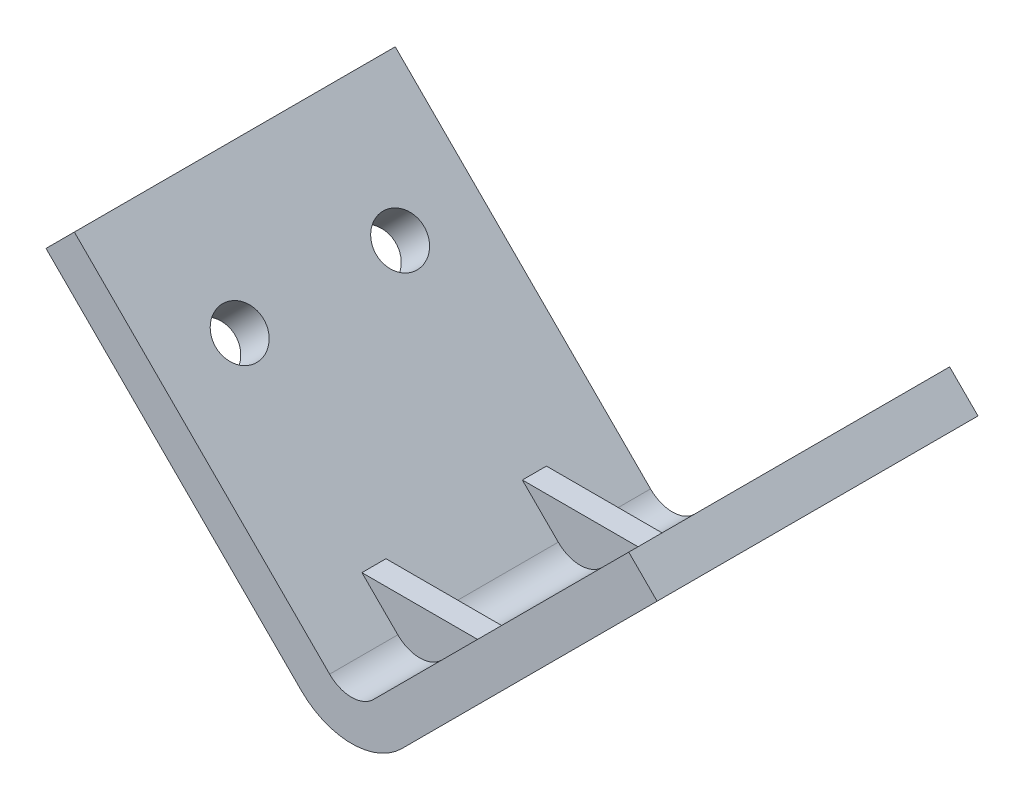
ISO-10303-21;
HEADER;
FILE_DESCRIPTION(('STEP AP214'),'2;1');
FILE_NAME('part.step','',(''),(''),'','','');
FILE_SCHEMA(('AUTOMOTIVE_DESIGN { 1 0 10303 214 1 1 1 1 }'));
ENDSEC;
DATA;
#1=APPLICATION_CONTEXT('core data for automotive mechanical design processes');
#2=APPLICATION_PROTOCOL_DEFINITION('international standard','automotive_design',2000,#1);
#3=PRODUCT_CONTEXT('',#1,'mechanical');
#4=PRODUCT('Part','Part','',(#3));
#5=PRODUCT_RELATED_PRODUCT_CATEGORY('part','',(#4));
#6=PRODUCT_DEFINITION_FORMATION('','',#4);
#7=PRODUCT_DEFINITION_CONTEXT('part definition',#1,'design');
#8=PRODUCT_DEFINITION('design','',#6,#7);
#9=PRODUCT_DEFINITION_SHAPE('','',#8);
#10=(LENGTH_UNIT() NAMED_UNIT(*) SI_UNIT(.MILLI.,.METRE.));
#11=(NAMED_UNIT(*) PLANE_ANGLE_UNIT() SI_UNIT($,.RADIAN.));
#12=(NAMED_UNIT(*) SI_UNIT($,.STERADIAN.) SOLID_ANGLE_UNIT());
#13=UNCERTAINTY_MEASURE_WITH_UNIT(LENGTH_MEASURE(1.E-05),#10,'distance_accuracy_value','');
#14=(GEOMETRIC_REPRESENTATION_CONTEXT(3) GLOBAL_UNCERTAINTY_ASSIGNED_CONTEXT((#13)) GLOBAL_UNIT_ASSIGNED_CONTEXT((#10,
#11,#12)) REPRESENTATION_CONTEXT('',''));
#15=CARTESIAN_POINT('',(0.,0.,0.));
#16=DIRECTION('',(0.,0.,1.));
#17=DIRECTION('',(1.,0.,0.));
#18=AXIS2_PLACEMENT_3D('',#15,#16,#17);
#19=CARTESIAN_POINT('',(50.,8.86619772367581,40.0000000008731));
#20=DIRECTION('',(0.,0.,-1.));
#21=DIRECTION('',(1.,0.,0.));
#22=AXIS2_PLACEMENT_3D('',#19,#20,#21);
#23=CYLINDRICAL_SURFACE('',#22,3.8661977236758);
#24=CARTESIAN_POINT('',(50.,8.86619772367581,28.5));
#25=DIRECTION('',(0.,0.,1.));
#26=DIRECTION('',(1.,0.,0.));
#27=AXIS2_PLACEMENT_3D('',#24,#25,#26);
#28=CIRCLE('',#27,3.8661977236758);
#29=CARTESIAN_POINT('',(52.7338146278192,6.13238309585666,28.5));
#30=VERTEX_POINT('',#29);
#31=CARTESIAN_POINT('',(47.2661853721808,6.13238309585665,28.5));
#32=VERTEX_POINT('',#31);
#33=EDGE_CURVE('E231',#30,#32,#28,.F.);
#34=ORIENTED_EDGE('',*,*,#33,.F.);
#35=DIRECTION('',(0.,0.,-1.));
#36=VECTOR('',#35,1.);
#37=CARTESIAN_POINT('',(52.7338146278192,6.13238309585666,0.));
#38=LINE('',#37,#36);
#39=CARTESIAN_POINT('',(52.7338146278192,6.13238309585666,11.5));
#40=VERTEX_POINT('',#39);
#41=EDGE_CURVE('E260',#30,#40,#38,.T.);
#42=ORIENTED_EDGE('',*,*,#41,.T.);
#43=CARTESIAN_POINT('',(50.,8.86619772367581,11.5));
#44=DIRECTION('',(0.,0.,-1.));
#45=DIRECTION('',(-1.,0.,0.));
#46=AXIS2_PLACEMENT_3D('',#43,#44,#45);
#47=CIRCLE('',#46,3.8661977236758);
#48=CARTESIAN_POINT('',(47.2661853721808,6.13238309585665,11.5));
#49=VERTEX_POINT('',#48);
#50=EDGE_CURVE('E249',#49,#40,#47,.F.);
#51=ORIENTED_EDGE('',*,*,#50,.F.);
#52=DIRECTION('',(0.,0.,-1.));
#53=VECTOR('',#52,1.);
#54=CARTESIAN_POINT('',(47.2661853721808,6.13238309585665,0.));
#55=LINE('',#54,#53);
#56=EDGE_CURVE('E274',#32,#49,#55,.T.);
#57=ORIENTED_EDGE('',*,*,#56,.F.);
#58=EDGE_LOOP('',(#34,#42,#51,#57));
#59=FACE_BOUND('',#58,.T.);
#60=ADVANCED_FACE('F95',(#59),#23,.F.);
#61=CARTESIAN_POINT('',(15.4463802187863,37.9521882492513,0.));
#62=DIRECTION('',(0.707106781186549,0.707106781186546,0.));
#63=DIRECTION('',(0.,0.,1.));
#64=AXIS2_PLACEMENT_3D('',#61,#62,#63);
#65=PLANE('',#64);
#66=CARTESIAN_POINT('',(26.0529819365845,27.3455865314531,10.));
#67=DIRECTION('',(-0.707106781186549,-0.707106781186546,0.));
#68=DIRECTION('',(0.,0.,1.));
#69=AXIS2_PLACEMENT_3D('',#66,#67,#68);
#70=CIRCLE('',#69,3.);
#71=CARTESIAN_POINT('',(26.0529819365845,27.3455865314531,13.));
#72=VERTEX_POINT('',#71);
#73=EDGE_CURVE('E270',#72,#72,#70,.T.);
#74=ORIENTED_EDGE('',*,*,#73,.T.);
#75=EDGE_LOOP('',(#74));
#76=FACE_BOUND('',#75,.T.);
#77=CARTESIAN_POINT('',(26.0529819365845,27.3455865314531,30.));
#78=DIRECTION('',(0.707106781186549,0.707106781186546,0.));
#79=DIRECTION('',(0.,0.,1.));
#80=AXIS2_PLACEMENT_3D('',#77,#78,#79);
#81=CIRCLE('',#80,3.);
#82=CARTESIAN_POINT('',(26.0529819365845,27.3455865314531,33.));
#83=VERTEX_POINT('',#82);
#84=EDGE_CURVE('E324',#83,#83,#81,.T.);
#85=ORIENTED_EDGE('',*,*,#84,.F.);
#86=EDGE_LOOP('',(#85));
#87=FACE_BOUND('',#86,.T.);
#88=DIRECTION('',(0.,0.,1.));
#89=VECTOR('',#88,1.);
#90=CARTESIAN_POINT('',(42.7919667502393,10.6066017177982,0.));
#91=LINE('',#90,#89);
#92=CARTESIAN_POINT('',(42.7919667502393,10.6066017177982,28.5));
#93=VERTEX_POINT('',#92);
#94=CARTESIAN_POINT('',(42.7919667502393,10.6066017177982,31.5));
#95=VERTEX_POINT('',#94);
#96=EDGE_CURVE('E110',#93,#95,#91,.T.);
#97=ORIENTED_EDGE('',*,*,#96,.F.);
#98=DIRECTION('',(0.707106781186546,-0.707106781186549,0.));
#99=VECTOR('',#98,1.);
#100=CARTESIAN_POINT('',(15.4463802187863,37.9521882492513,28.5));
#101=LINE('',#100,#99);
#102=EDGE_CURVE('E234',#93,#32,#101,.T.);
#103=ORIENTED_EDGE('',*,*,#102,.T.);
#104=ORIENTED_EDGE('',*,*,#56,.T.);
#105=DIRECTION('',(-0.707106781186546,0.707106781186549,0.));
#106=VECTOR('',#105,1.);
#107=CARTESIAN_POINT('',(15.4463802187863,37.9521882492513,11.5));
#108=LINE('',#107,#106);
#109=CARTESIAN_POINT('',(42.7919667502393,10.6066017177982,11.5));
#110=VERTEX_POINT('',#109);
#111=EDGE_CURVE('E252',#49,#110,#108,.T.);
#112=ORIENTED_EDGE('',*,*,#111,.T.);
#113=DIRECTION('',(0.,0.,-1.));
#114=VECTOR('',#113,1.);
#115=CARTESIAN_POINT('',(42.7919667502393,10.6066017177982,0.));
#116=LINE('',#115,#114);
#117=CARTESIAN_POINT('',(42.7919667502393,10.6066017177982,8.5));
#118=VERTEX_POINT('',#117);
#119=EDGE_CURVE('E254',#110,#118,#116,.T.);
#120=ORIENTED_EDGE('',*,*,#119,.T.);
#121=DIRECTION('',(-0.707106781186546,0.707106781186549,0.));
#122=VECTOR('',#121,1.);
#123=CARTESIAN_POINT('',(15.4463802187863,37.9521882492513,8.5));
#124=LINE('',#123,#122);
#125=CARTESIAN_POINT('',(47.2661853721808,6.13238309585665,8.5));
#126=VERTEX_POINT('',#125);
#127=EDGE_CURVE('E246',#126,#118,#124,.T.);
#128=ORIENTED_EDGE('',*,*,#127,.F.);
#129=CARTESIAN_POINT('',(47.2661853721808,6.13238309585665,0.));
#130=VERTEX_POINT('',#129);
#131=EDGE_CURVE('E275',#126,#130,#55,.T.);
#132=ORIENTED_EDGE('',*,*,#131,.T.);
#133=DIRECTION('',(-0.707106781186546,0.707106781186549,0.));
#134=VECTOR('',#133,1.);
#135=CARTESIAN_POINT('',(15.4463802187863,37.9521882492513,0.));
#136=LINE('',#135,#134);
#137=CARTESIAN_POINT('',(15.4463802187863,37.9521882492513,0.));
#138=VERTEX_POINT('',#137);
#139=EDGE_CURVE('E305',#130,#138,#136,.T.);
#140=ORIENTED_EDGE('',*,*,#139,.T.);
#141=DIRECTION('',(0.,0.,1.));
#142=VECTOR('',#141,1.);
#143=CARTESIAN_POINT('',(15.4463802187863,37.9521882492513,0.));
#144=LINE('',#143,#142);
#145=CARTESIAN_POINT('',(15.4463802187863,37.9521882492513,40.));
#146=VERTEX_POINT('',#145);
#147=EDGE_CURVE('E308',#138,#146,#144,.T.);
#148=ORIENTED_EDGE('',*,*,#147,.T.);
#149=DIRECTION('',(0.707106781186546,-0.707106781186549,0.));
#150=VECTOR('',#149,1.);
#151=CARTESIAN_POINT('',(15.4463802187863,37.9521882492513,40.));
#152=LINE('',#151,#150);
#153=CARTESIAN_POINT('',(47.2661853721808,6.13238309585665,40.));
#154=VERTEX_POINT('',#153);
#155=EDGE_CURVE('E273',#146,#154,#152,.T.);
#156=ORIENTED_EDGE('',*,*,#155,.T.);
#157=CARTESIAN_POINT('',(47.2661853721808,6.13238309585665,31.5));
#158=VERTEX_POINT('',#157);
#159=EDGE_CURVE('E271',#154,#158,#55,.T.);
#160=ORIENTED_EDGE('',*,*,#159,.T.);
#161=DIRECTION('',(0.707106781186546,-0.707106781186549,0.));
#162=VECTOR('',#161,1.);
#163=CARTESIAN_POINT('',(15.4463802187863,37.9521882492513,31.5));
#164=LINE('',#163,#162);
#165=EDGE_CURVE('E115',#95,#158,#164,.T.);
#166=ORIENTED_EDGE('',*,*,#165,.F.);
#167=EDGE_LOOP('',(#97,#103,#104,#112,#120,#128,#132,#140,#148,#156,#160,#166));
#168=FACE_BOUND('',#167,.T.);
#169=ADVANCED_FACE('F404',(#76,#87,#168),#65,.T.);
#170=CARTESIAN_POINT('',(13.8429416625591,-32.7584898694035,0.));
#171=DIRECTION('',(-0.707106781186549,0.707106781186546,0.));
#172=DIRECTION('',(0.,0.,1.));
#173=AXIS2_PLACEMENT_3D('',#170,#171,#172);
#174=PLANE('',#173);
#175=CARTESIAN_POINT('',(73.9470180634156,27.3455865314531,30.));
#176=DIRECTION('',(0.707106781186549,-0.707106781186546,0.));
#177=DIRECTION('',(0.,0.,1.));
#178=AXIS2_PLACEMENT_3D('',#175,#176,#177);
#179=CIRCLE('',#178,3.00000000000001);
#180=CARTESIAN_POINT('',(73.9470180634156,27.3455865314531,33.));
#181=VERTEX_POINT('',#180);
#182=EDGE_CURVE('E304',#181,#181,#179,.T.);
#183=ORIENTED_EDGE('',*,*,#182,.T.);
#184=EDGE_LOOP('',(#183));
#185=FACE_BOUND('',#184,.T.);
#186=CARTESIAN_POINT('',(73.9470180634156,27.3455865314531,10.));
#187=DIRECTION('',(-0.707106781186549,0.707106781186546,0.));
#188=DIRECTION('',(0.,0.,1.));
#189=AXIS2_PLACEMENT_3D('',#186,#187,#188);
#190=CIRCLE('',#189,3.00000000000001);
#191=CARTESIAN_POINT('',(73.9470180634156,27.3455865314531,13.));
#192=VERTEX_POINT('',#191);
#193=EDGE_CURVE('E256',#192,#192,#190,.T.);
#194=ORIENTED_EDGE('',*,*,#193,.F.);
#195=EDGE_LOOP('',(#194));
#196=FACE_BOUND('',#195,.T.);
#197=ORIENTED_EDGE('',*,*,#41,.F.);
#198=DIRECTION('',(0.707106781186546,0.707106781186549,0.));
#199=VECTOR('',#198,1.);
#200=CARTESIAN_POINT('',(13.8429416625591,-32.7584898694035,28.5));
#201=LINE('',#200,#199);
#202=CARTESIAN_POINT('',(57.2080332497607,10.6066017177982,28.5));
#203=VERTEX_POINT('',#202);
#204=EDGE_CURVE('E211',#30,#203,#201,.T.);
#205=ORIENTED_EDGE('',*,*,#204,.T.);
#206=DIRECTION('',(0.,0.,-1.));
#207=VECTOR('',#206,1.);
#208=CARTESIAN_POINT('',(57.2080332497607,10.6066017177982,0.));
#209=LINE('',#208,#207);
#210=CARTESIAN_POINT('',(57.2080332497607,10.6066017177982,31.5));
#211=VERTEX_POINT('',#210);
#212=EDGE_CURVE('E13',#211,#203,#209,.T.);
#213=ORIENTED_EDGE('',*,*,#212,.F.);
#214=DIRECTION('',(0.707106781186546,0.707106781186549,0.));
#215=VECTOR('',#214,1.);
#216=CARTESIAN_POINT('',(13.8429416625591,-32.7584898694035,31.5));
#217=LINE('',#216,#215);
#218=CARTESIAN_POINT('',(52.7338146278192,6.13238309585666,31.5));
#219=VERTEX_POINT('',#218);
#220=EDGE_CURVE('E208',#219,#211,#217,.T.);
#221=ORIENTED_EDGE('',*,*,#220,.F.);
#222=CARTESIAN_POINT('',(52.7338146278192,6.13238309585666,40.));
#223=VERTEX_POINT('',#222);
#224=EDGE_CURVE('E257',#223,#219,#38,.T.);
#225=ORIENTED_EDGE('',*,*,#224,.F.);
#226=DIRECTION('',(0.707106781186546,0.707106781186549,0.));
#227=VECTOR('',#226,1.);
#228=CARTESIAN_POINT('',(13.8429416625591,-32.7584898694035,40.));
#229=LINE('',#228,#227);
#230=CARTESIAN_POINT('',(84.5536197812137,37.9521882492513,40.));
#231=VERTEX_POINT('',#230);
#232=EDGE_CURVE('E311',#223,#231,#229,.T.);
#233=ORIENTED_EDGE('',*,*,#232,.T.);
#234=DIRECTION('',(0.,0.,-1.));
#235=VECTOR('',#234,1.);
#236=CARTESIAN_POINT('',(84.5536197812138,37.9521882492514,0.));
#237=LINE('',#236,#235);
#238=CARTESIAN_POINT('',(84.5536197812137,37.9521882492513,0.));
#239=VERTEX_POINT('',#238);
#240=EDGE_CURVE('E303',#231,#239,#237,.T.);
#241=ORIENTED_EDGE('',*,*,#240,.T.);
#242=DIRECTION('',(-0.707106781186546,-0.707106781186549,0.));
#243=VECTOR('',#242,1.);
#244=CARTESIAN_POINT('',(13.8429416625591,-32.7584898694035,0.));
#245=LINE('',#244,#243);
#246=CARTESIAN_POINT('',(52.7338146278192,6.13238309585666,0.));
#247=VERTEX_POINT('',#246);
#248=EDGE_CURVE('E300',#239,#247,#245,.T.);
#249=ORIENTED_EDGE('',*,*,#248,.T.);
#250=CARTESIAN_POINT('',(52.7338146278192,6.13238309585665,8.5));
#251=VERTEX_POINT('',#250);
#252=EDGE_CURVE('E261',#251,#247,#38,.T.);
#253=ORIENTED_EDGE('',*,*,#252,.F.);
#254=DIRECTION('',(-0.707106781186546,-0.707106781186549,0.));
#255=VECTOR('',#254,1.);
#256=CARTESIAN_POINT('',(13.8429416625591,-32.7584898694035,8.5));
#257=LINE('',#256,#255);
#258=CARTESIAN_POINT('',(57.2080332497607,10.6066017177982,8.5));
#259=VERTEX_POINT('',#258);
#260=EDGE_CURVE('E348',#259,#251,#257,.T.);
#261=ORIENTED_EDGE('',*,*,#260,.F.);
#262=DIRECTION('',(0.,0.,1.));
#263=VECTOR('',#262,1.);
#264=CARTESIAN_POINT('',(57.2080332497607,10.6066017177982,0.));
#265=LINE('',#264,#263);
#266=CARTESIAN_POINT('',(57.2080332497607,10.6066017177982,11.5));
#267=VERTEX_POINT('',#266);
#268=EDGE_CURVE('E382',#259,#267,#265,.T.);
#269=ORIENTED_EDGE('',*,*,#268,.T.);
#270=DIRECTION('',(-0.707106781186546,-0.707106781186549,0.));
#271=VECTOR('',#270,1.);
#272=CARTESIAN_POINT('',(13.8429416625591,-32.7584898694035,11.5));
#273=LINE('',#272,#271);
#274=EDGE_CURVE('E103',#267,#40,#273,.T.);
#275=ORIENTED_EDGE('',*,*,#274,.T.);
#276=EDGE_LOOP('',(#197,#205,#213,#221,#225,#233,#241,#249,#253,#261,#269,#275));
#277=FACE_BOUND('',#276,.T.);
#278=ADVANCED_FACE('F207',(#185,#196,#277),#174,.T.);
#279=ORIENTED_EDGE('',*,*,#224,.T.);
#280=CARTESIAN_POINT('',(50.,8.86619772367581,31.5));
#281=DIRECTION('',(0.,0.,1.));
#282=DIRECTION('',(1.,0.,0.));
#283=AXIS2_PLACEMENT_3D('',#280,#281,#282);
#284=CIRCLE('',#283,3.8661977236758);
#285=EDGE_CURVE('E221',#219,#158,#284,.F.);
#286=ORIENTED_EDGE('',*,*,#285,.T.);
#287=ORIENTED_EDGE('',*,*,#159,.F.);
#288=CARTESIAN_POINT('',(50.,8.86619772367581,40.));
#289=DIRECTION('',(0.,0.,-1.));
#290=DIRECTION('',(-1.,0.,0.));
#291=AXIS2_PLACEMENT_3D('',#288,#289,#290);
#292=CIRCLE('',#291,3.8661977236758);
#293=EDGE_CURVE('E259',#154,#223,#292,.F.);
#294=ORIENTED_EDGE('',*,*,#293,.T.);
#295=EDGE_LOOP('',(#279,#286,#287,#294));
#296=FACE_BOUND('',#295,.T.);
#297=ADVANCED_FACE('F414',(#296),#23,.F.);
#298=CARTESIAN_POINT('',(22.5174480306517,23.8100526255204,10.));
#299=DIRECTION('',(0.707106781186549,0.707106781186546,0.));
#300=DIRECTION('',(0.,0.,1.));
#301=AXIS2_PLACEMENT_3D('',#298,#299,#300);
#302=CYLINDRICAL_SURFACE('',#301,3.);
#303=ORIENTED_EDGE('',*,*,#73,.F.);
#304=EDGE_LOOP('',(#303));
#305=FACE_BOUND('',#304,.T.);
#306=CARTESIAN_POINT('',(22.5174480306517,23.8100526255204,10.));
#307=DIRECTION('',(-0.707106781186549,-0.707106781186546,0.));
#308=DIRECTION('',(0.,0.,1.));
#309=AXIS2_PLACEMENT_3D('',#306,#307,#308);
#310=CIRCLE('',#309,3.);
#311=CARTESIAN_POINT('',(22.5174480306517,23.8100526255204,13.));
#312=VERTEX_POINT('',#311);
#313=EDGE_CURVE('E345',#312,#312,#310,.T.);
#314=ORIENTED_EDGE('',*,*,#313,.T.);
#315=EDGE_LOOP('',(#314));
#316=FACE_BOUND('',#315,.T.);
#317=ADVANCED_FACE('F437',(#305,#316),#302,.F.);
#318=CARTESIAN_POINT('',(77.4825519693483,23.8100526255204,30.));
#319=DIRECTION('',(-0.707106781186549,0.707106781186546,0.));
#320=DIRECTION('',(0.,0.,1.));
#321=AXIS2_PLACEMENT_3D('',#318,#319,#320);
#322=CYLINDRICAL_SURFACE('',#321,3.00000000000001);
#323=ORIENTED_EDGE('',*,*,#182,.F.);
#324=EDGE_LOOP('',(#323));
#325=FACE_BOUND('',#324,.T.);
#326=CARTESIAN_POINT('',(77.4825519693483,23.8100526255204,30.));
#327=DIRECTION('',(0.707106781186549,-0.707106781186546,0.));
#328=DIRECTION('',(0.,0.,1.));
#329=AXIS2_PLACEMENT_3D('',#326,#327,#328);
#330=CIRCLE('',#329,3.00000000000001);
#331=CARTESIAN_POINT('',(77.4825519693483,23.8100526255204,33.));
#332=VERTEX_POINT('',#331);
#333=EDGE_CURVE('E349',#332,#332,#330,.T.);
#334=ORIENTED_EDGE('',*,*,#333,.T.);
#335=EDGE_LOOP('',(#334));
#336=FACE_BOUND('',#335,.T.);
#337=ADVANCED_FACE('F439',(#325,#336),#322,.F.);
#338=CARTESIAN_POINT('',(77.4825519693483,23.8100526255204,10.));
#339=DIRECTION('',(-0.707106781186549,0.707106781186546,0.));
#340=DIRECTION('',(0.,0.,1.));
#341=AXIS2_PLACEMENT_3D('',#338,#339,#340);
#342=CYLINDRICAL_SURFACE('',#341,3.00000000000001);
#343=ORIENTED_EDGE('',*,*,#193,.T.);
#344=EDGE_LOOP('',(#343));
#345=FACE_BOUND('',#344,.T.);
#346=CARTESIAN_POINT('',(77.4825519693483,23.8100526255204,10.));
#347=DIRECTION('',(-0.707106781186549,0.707106781186546,0.));
#348=DIRECTION('',(0.,0.,1.));
#349=AXIS2_PLACEMENT_3D('',#346,#347,#348);
#350=CIRCLE('',#349,3.00000000000001);
#351=CARTESIAN_POINT('',(77.4825519693483,23.8100526255204,13.));
#352=VERTEX_POINT('',#351);
#353=EDGE_CURVE('E265',#352,#352,#350,.T.);
#354=ORIENTED_EDGE('',*,*,#353,.F.);
#355=EDGE_LOOP('',(#354));
#356=FACE_BOUND('',#355,.T.);
#357=ADVANCED_FACE('F446',(#345,#356),#342,.F.);
#358=CARTESIAN_POINT('',(22.5174480306517,23.8100526255204,30.));
#359=DIRECTION('',(0.707106781186549,0.707106781186546,0.));
#360=DIRECTION('',(0.,0.,1.));
#361=AXIS2_PLACEMENT_3D('',#358,#359,#360);
#362=CYLINDRICAL_SURFACE('',#361,3.);
#363=ORIENTED_EDGE('',*,*,#84,.T.);
#364=EDGE_LOOP('',(#363));
#365=FACE_BOUND('',#364,.T.);
#366=CARTESIAN_POINT('',(22.5174480306517,23.8100526255204,30.));
#367=DIRECTION('',(0.707106781186549,0.707106781186546,0.));
#368=DIRECTION('',(0.,0.,1.));
#369=AXIS2_PLACEMENT_3D('',#366,#367,#368);
#370=CIRCLE('',#369,3.);
#371=CARTESIAN_POINT('',(22.5174480306517,23.8100526255204,33.));
#372=VERTEX_POINT('',#371);
#373=EDGE_CURVE('E334',#372,#372,#370,.T.);
#374=ORIENTED_EDGE('',*,*,#373,.F.);
#375=EDGE_LOOP('',(#374));
#376=FACE_BOUND('',#375,.T.);
#377=ADVANCED_FACE('F461',(#365,#376),#362,.F.);
#378=ORIENTED_EDGE('',*,*,#131,.F.);
#379=CARTESIAN_POINT('',(50.,8.86619772367581,8.5));
#380=DIRECTION('',(0.,0.,-1.));
#381=DIRECTION('',(-1.,0.,0.));
#382=AXIS2_PLACEMENT_3D('',#379,#380,#381);
#383=CIRCLE('',#382,3.8661977236758);
#384=EDGE_CURVE('E241',#126,#251,#383,.F.);
#385=ORIENTED_EDGE('',*,*,#384,.T.);
#386=ORIENTED_EDGE('',*,*,#252,.T.);
#387=CARTESIAN_POINT('',(50.,8.86619772367581,0.));
#388=DIRECTION('',(0.,0.,-1.));
#389=DIRECTION('',(-1.,0.,0.));
#390=AXIS2_PLACEMENT_3D('',#387,#388,#389);
#391=CIRCLE('',#390,3.8661977236758);
#392=EDGE_CURVE('E366',#247,#130,#391,.T.);
#393=ORIENTED_EDGE('',*,*,#392,.T.);
#394=EDGE_LOOP('',(#378,#385,#386,#393));
#395=FACE_BOUND('',#394,.T.);
#396=ADVANCED_FACE('F395',(#395),#23,.F.);
#397=CARTESIAN_POINT('',(17.3784755684919,-36.2940237753363,0.));
#398=DIRECTION('',(-0.707106781186549,0.707106781186546,0.));
#399=DIRECTION('',(0.,0.,1.));
#400=AXIS2_PLACEMENT_3D('',#397,#398,#399);
#401=PLANE('',#400);
#402=ORIENTED_EDGE('',*,*,#333,.F.);
#403=EDGE_LOOP('',(#402));
#404=FACE_BOUND('',#403,.T.);
#405=ORIENTED_EDGE('',*,*,#353,.T.);
#406=EDGE_LOOP('',(#405));
#407=FACE_BOUND('',#406,.T.);
#408=DIRECTION('',(0.707106781186546,0.707106781186549,0.));
#409=VECTOR('',#408,1.);
#410=CARTESIAN_POINT('',(17.3784755684919,-36.2940237753363,40.));
#411=LINE('',#410,#409);
#412=CARTESIAN_POINT('',(56.2693485337519,2.59684918992392,40.));
#413=VERTEX_POINT('',#412);
#414=CARTESIAN_POINT('',(88.0891536871465,34.4166543433186,40.));
#415=VERTEX_POINT('',#414);
#416=EDGE_CURVE('E266',#413,#415,#411,.T.);
#417=ORIENTED_EDGE('',*,*,#416,.F.);
#418=DIRECTION('',(0.,0.,-1.));
#419=VECTOR('',#418,1.);
#420=CARTESIAN_POINT('',(56.2693485337519,2.59684918992393,0.));
#421=LINE('',#420,#419);
#422=CARTESIAN_POINT('',(56.2693485337519,2.59684918992392,0.));
#423=VERTEX_POINT('',#422);
#424=EDGE_CURVE('E262',#413,#423,#421,.T.);
#425=ORIENTED_EDGE('',*,*,#424,.T.);
#426=DIRECTION('',(-0.707106781186546,-0.707106781186549,0.));
#427=VECTOR('',#426,1.);
#428=CARTESIAN_POINT('',(17.3784755684919,-36.2940237753363,0.));
#429=LINE('',#428,#427);
#430=CARTESIAN_POINT('',(88.0891536871465,34.4166543433186,0.));
#431=VERTEX_POINT('',#430);
#432=EDGE_CURVE('E291',#431,#423,#429,.T.);
#433=ORIENTED_EDGE('',*,*,#432,.F.);
#434=DIRECTION('',(0.,0.,-1.));
#435=VECTOR('',#434,1.);
#436=CARTESIAN_POINT('',(88.0891536871465,34.4166543433186,0.));
#437=LINE('',#436,#435);
#438=EDGE_CURVE('E285',#415,#431,#437,.T.);
#439=ORIENTED_EDGE('',*,*,#438,.F.);
#440=EDGE_LOOP('',(#417,#425,#433,#439));
#441=FACE_BOUND('',#440,.T.);
#442=ADVANCED_FACE('F420',(#404,#407,#441),#401,.F.);
#443=CARTESIAN_POINT('',(13.8429416625591,-32.7584898694035,40.));
#444=DIRECTION('',(0.,0.,-1.));
#445=DIRECTION('',(-0.707106781186546,-0.707106781186549,0.));
#446=AXIS2_PLACEMENT_3D('',#443,#444,#445);
#447=PLANE('',#446);
#448=ORIENTED_EDGE('',*,*,#232,.F.);
#449=ORIENTED_EDGE('',*,*,#293,.F.);
#450=ORIENTED_EDGE('',*,*,#155,.F.);
#451=DIRECTION('',(-0.707106781186549,-0.707106781186546,0.));
#452=VECTOR('',#451,1.);
#453=CARTESIAN_POINT('',(15.4463802187863,37.9521882492513,40.));
#454=LINE('',#453,#452);
#455=CARTESIAN_POINT('',(11.9108463128535,34.4166543433186,40.));
#456=VERTEX_POINT('',#455);
#457=EDGE_CURVE('E276',#146,#456,#454,.T.);
#458=ORIENTED_EDGE('',*,*,#457,.T.);
#459=DIRECTION('',(0.707106781186546,-0.707106781186549,0.));
#460=VECTOR('',#459,1.);
#461=CARTESIAN_POINT('',(11.9108463128535,34.4166543433186,40.));
#462=LINE('',#461,#460);
#463=CARTESIAN_POINT('',(43.7306514662481,2.59684918992392,40.));
#464=VERTEX_POINT('',#463);
#465=EDGE_CURVE('E280',#456,#464,#462,.T.);
#466=ORIENTED_EDGE('',*,*,#465,.T.);
#467=CARTESIAN_POINT('',(50.,8.86619772367581,40.));
#468=DIRECTION('',(0.,0.,-1.));
#469=DIRECTION('',(-1.,0.,0.));
#470=AXIS2_PLACEMENT_3D('',#467,#468,#469);
#471=CIRCLE('',#470,8.86619772367581);
#472=EDGE_CURVE('E269',#464,#413,#471,.F.);
#473=ORIENTED_EDGE('',*,*,#472,.T.);
#474=ORIENTED_EDGE('',*,*,#416,.T.);
#475=DIRECTION('',(0.707106781186549,-0.707106781186546,0.));
#476=VECTOR('',#475,1.);
#477=CARTESIAN_POINT('',(84.5536197812138,37.9521882492514,40.));
#478=LINE('',#477,#476);
#479=EDGE_CURVE('E283',#231,#415,#478,.T.);
#480=ORIENTED_EDGE('',*,*,#479,.F.);
#481=EDGE_LOOP('',(#448,#449,#450,#458,#466,#473,#474,#480));
#482=FACE_BOUND('',#481,.T.);
#483=ADVANCED_FACE('F412',(#482),#447,.F.);
#484=CARTESIAN_POINT('',(13.8429416625591,-32.7584898694035,0.));
#485=DIRECTION('',(0.,0.,1.));
#486=DIRECTION('',(0.707106781186546,0.707106781186549,0.));
#487=AXIS2_PLACEMENT_3D('',#484,#485,#486);
#488=PLANE('',#487);
#489=ORIENTED_EDGE('',*,*,#432,.T.);
#490=CARTESIAN_POINT('',(50.,8.86619772367581,0.));
#491=DIRECTION('',(0.,0.,-1.));
#492=DIRECTION('',(-1.,0.,0.));
#493=AXIS2_PLACEMENT_3D('',#490,#491,#492);
#494=CIRCLE('',#493,8.86619772367581);
#495=CARTESIAN_POINT('',(43.7306514662481,2.59684918992392,0.));
#496=VERTEX_POINT('',#495);
#497=EDGE_CURVE('E292',#423,#496,#494,.T.);
#498=ORIENTED_EDGE('',*,*,#497,.T.);
#499=DIRECTION('',(-0.707106781186546,0.707106781186549,0.));
#500=VECTOR('',#499,1.);
#501=CARTESIAN_POINT('',(11.9108463128535,34.4166543433186,0.));
#502=LINE('',#501,#500);
#503=CARTESIAN_POINT('',(11.9108463128535,34.4166543433186,0.));
#504=VERTEX_POINT('',#503);
#505=EDGE_CURVE('E286',#496,#504,#502,.T.);
#506=ORIENTED_EDGE('',*,*,#505,.T.);
#507=DIRECTION('',(-0.707106781186549,-0.707106781186546,0.));
#508=VECTOR('',#507,1.);
#509=CARTESIAN_POINT('',(15.4463802187863,37.9521882492513,0.));
#510=LINE('',#509,#508);
#511=EDGE_CURVE('E279',#138,#504,#510,.T.);
#512=ORIENTED_EDGE('',*,*,#511,.F.);
#513=ORIENTED_EDGE('',*,*,#139,.F.);
#514=ORIENTED_EDGE('',*,*,#392,.F.);
#515=ORIENTED_EDGE('',*,*,#248,.F.);
#516=DIRECTION('',(0.707106781186549,-0.707106781186546,0.));
#517=VECTOR('',#516,1.);
#518=CARTESIAN_POINT('',(84.5536197812138,37.9521882492514,0.));
#519=LINE('',#518,#517);
#520=EDGE_CURVE('E289',#239,#431,#519,.T.);
#521=ORIENTED_EDGE('',*,*,#520,.T.);
#522=EDGE_LOOP('',(#489,#498,#506,#512,#513,#514,#515,#521));
#523=FACE_BOUND('',#522,.T.);
#524=ADVANCED_FACE('F402',(#523),#488,.F.);
#525=CARTESIAN_POINT('',(50.,8.86619772367581,40.0000000008731));
#526=DIRECTION('',(0.,0.,-1.));
#527=DIRECTION('',(1.,0.,0.));
#528=AXIS2_PLACEMENT_3D('',#525,#526,#527);
#529=CYLINDRICAL_SURFACE('',#528,8.86619772367581);
#530=ORIENTED_EDGE('',*,*,#424,.F.);
#531=ORIENTED_EDGE('',*,*,#472,.F.);
#532=DIRECTION('',(0.,0.,-1.));
#533=VECTOR('',#532,1.);
#534=CARTESIAN_POINT('',(43.7306514662481,2.59684918992392,0.));
#535=LINE('',#534,#533);
#536=EDGE_CURVE('E267',#464,#496,#535,.T.);
#537=ORIENTED_EDGE('',*,*,#536,.T.);
#538=ORIENTED_EDGE('',*,*,#497,.F.);
#539=EDGE_LOOP('',(#530,#531,#537,#538));
#540=FACE_BOUND('',#539,.T.);
#541=ADVANCED_FACE('F425',(#540),#529,.T.);
#542=CARTESIAN_POINT('',(11.9108463128535,34.4166543433186,0.));
#543=DIRECTION('',(0.707106781186549,0.707106781186546,0.));
#544=DIRECTION('',(0.,0.,1.));
#545=AXIS2_PLACEMENT_3D('',#542,#543,#544);
#546=PLANE('',#545);
#547=ORIENTED_EDGE('',*,*,#536,.F.);
#548=ORIENTED_EDGE('',*,*,#465,.F.);
#549=DIRECTION('',(0.,0.,1.));
#550=VECTOR('',#549,1.);
#551=CARTESIAN_POINT('',(11.9108463128535,34.4166543433186,0.));
#552=LINE('',#551,#550);
#553=EDGE_CURVE('E297',#504,#456,#552,.T.);
#554=ORIENTED_EDGE('',*,*,#553,.F.);
#555=ORIENTED_EDGE('',*,*,#505,.F.);
#556=EDGE_LOOP('',(#547,#548,#554,#555));
#557=FACE_BOUND('',#556,.T.);
#558=ORIENTED_EDGE('',*,*,#373,.T.);
#559=EDGE_LOOP('',(#558));
#560=FACE_BOUND('',#559,.T.);
#561=ORIENTED_EDGE('',*,*,#313,.F.);
#562=EDGE_LOOP('',(#561));
#563=FACE_BOUND('',#562,.T.);
#564=ADVANCED_FACE('F429',(#557,#560,#563),#546,.F.);
#565=CARTESIAN_POINT('',(15.4463802187863,37.9521882492513,0.));
#566=DIRECTION('',(0.707106781186546,-0.707106781186549,0.));
#567=DIRECTION('',(0.,0.,-1.));
#568=AXIS2_PLACEMENT_3D('',#565,#566,#567);
#569=PLANE('',#568);
#570=ORIENTED_EDGE('',*,*,#553,.T.);
#571=ORIENTED_EDGE('',*,*,#457,.F.);
#572=ORIENTED_EDGE('',*,*,#147,.F.);
#573=ORIENTED_EDGE('',*,*,#511,.T.);
#574=EDGE_LOOP('',(#570,#571,#572,#573));
#575=FACE_BOUND('',#574,.T.);
#576=ADVANCED_FACE('F406',(#575),#569,.F.);
#577=CARTESIAN_POINT('',(84.5536197812138,37.9521882492514,0.));
#578=DIRECTION('',(-0.707106781186546,-0.707106781186549,0.));
#579=DIRECTION('',(0.,0.,1.));
#580=AXIS2_PLACEMENT_3D('',#577,#578,#579);
#581=PLANE('',#580);
#582=ORIENTED_EDGE('',*,*,#438,.T.);
#583=ORIENTED_EDGE('',*,*,#520,.F.);
#584=ORIENTED_EDGE('',*,*,#240,.F.);
#585=ORIENTED_EDGE('',*,*,#479,.T.);
#586=EDGE_LOOP('',(#582,#583,#584,#585));
#587=FACE_BOUND('',#586,.T.);
#588=ADVANCED_FACE('F97',(#587),#581,.F.);
#589=CARTESIAN_POINT('',(39.3933982822017,10.6066017177982,11.5));
#590=DIRECTION('',(0.,-1.,0.));
#591=DIRECTION('',(0.,0.,-1.));
#592=AXIS2_PLACEMENT_3D('',#589,#590,#591);
#593=PLANE('',#592);
#594=ORIENTED_EDGE('',*,*,#119,.F.);
#595=DIRECTION('',(-1.,0.,0.));
#596=VECTOR('',#595,1.);
#597=CARTESIAN_POINT('',(39.3933982822017,10.6066017177982,11.5));
#598=LINE('',#597,#596);
#599=EDGE_CURVE('E238',#267,#110,#598,.T.);
#600=ORIENTED_EDGE('',*,*,#599,.F.);
#601=ORIENTED_EDGE('',*,*,#268,.F.);
#602=DIRECTION('',(-1.,0.,0.));
#603=VECTOR('',#602,1.);
#604=CARTESIAN_POINT('',(39.3933982822017,10.6066017177982,8.5));
#605=LINE('',#604,#603);
#606=EDGE_CURVE('E237',#259,#118,#605,.T.);
#607=ORIENTED_EDGE('',*,*,#606,.T.);
#608=EDGE_LOOP('',(#594,#600,#601,#607));
#609=FACE_BOUND('',#608,.T.);
#610=ADVANCED_FACE('F493',(#609),#593,.F.);
#611=CARTESIAN_POINT('',(0.,0.,11.5));
#612=DIRECTION('',(0.,0.,-1.));
#613=DIRECTION('',(-1.,0.,0.));
#614=AXIS2_PLACEMENT_3D('',#611,#612,#613);
#615=PLANE('',#614);
#616=ORIENTED_EDGE('',*,*,#111,.F.);
#617=ORIENTED_EDGE('',*,*,#50,.T.);
#618=ORIENTED_EDGE('',*,*,#274,.F.);
#619=ORIENTED_EDGE('',*,*,#599,.T.);
#620=EDGE_LOOP('',(#616,#617,#618,#619));
#621=FACE_BOUND('',#620,.T.);
#622=ADVANCED_FACE('F390',(#621),#615,.F.);
#623=CARTESIAN_POINT('',(0.,0.,8.5));
#624=DIRECTION('',(0.,0.,-1.));
#625=DIRECTION('',(-1.,0.,0.));
#626=AXIS2_PLACEMENT_3D('',#623,#624,#625);
#627=PLANE('',#626);
#628=ORIENTED_EDGE('',*,*,#384,.F.);
#629=ORIENTED_EDGE('',*,*,#127,.T.);
#630=ORIENTED_EDGE('',*,*,#606,.F.);
#631=ORIENTED_EDGE('',*,*,#260,.T.);
#632=EDGE_LOOP('',(#628,#629,#630,#631));
#633=FACE_BOUND('',#632,.T.);
#634=ADVANCED_FACE('F501',(#633),#627,.T.);
#635=CARTESIAN_POINT('',(39.3933982822017,10.6066017177982,28.5));
#636=DIRECTION('',(0.,1.,0.));
#637=DIRECTION('',(0.,0.,1.));
#638=AXIS2_PLACEMENT_3D('',#635,#636,#637);
#639=PLANE('',#638);
#640=DIRECTION('',(-1.,0.,0.));
#641=VECTOR('',#640,1.);
#642=CARTESIAN_POINT('',(39.3933982822017,10.6066017177982,28.5));
#643=LINE('',#642,#641);
#644=EDGE_CURVE('E222',#203,#93,#643,.T.);
#645=ORIENTED_EDGE('',*,*,#644,.T.);
#646=ORIENTED_EDGE('',*,*,#96,.T.);
#647=DIRECTION('',(-1.,0.,0.));
#648=VECTOR('',#647,1.);
#649=CARTESIAN_POINT('',(39.3933982822017,10.6066017177982,31.5));
#650=LINE('',#649,#648);
#651=EDGE_CURVE('E220',#211,#95,#650,.T.);
#652=ORIENTED_EDGE('',*,*,#651,.F.);
#653=ORIENTED_EDGE('',*,*,#212,.T.);
#654=EDGE_LOOP('',(#645,#646,#652,#653));
#655=FACE_BOUND('',#654,.T.);
#656=ADVANCED_FACE('F224',(#655),#639,.T.);
#657=CARTESIAN_POINT('',(0.,0.,28.5));
#658=DIRECTION('',(0.,0.,1.));
#659=DIRECTION('',(-1.,0.,0.));
#660=AXIS2_PLACEMENT_3D('',#657,#658,#659);
#661=PLANE('',#660);
#662=ORIENTED_EDGE('',*,*,#102,.F.);
#663=ORIENTED_EDGE('',*,*,#644,.F.);
#664=ORIENTED_EDGE('',*,*,#204,.F.);
#665=ORIENTED_EDGE('',*,*,#33,.T.);
#666=EDGE_LOOP('',(#662,#663,#664,#665));
#667=FACE_BOUND('',#666,.T.);
#668=ADVANCED_FACE('F510',(#667),#661,.F.);
#669=CARTESIAN_POINT('',(0.,0.,31.5));
#670=DIRECTION('',(0.,0.,1.));
#671=DIRECTION('',(-1.,0.,0.));
#672=AXIS2_PLACEMENT_3D('',#669,#670,#671);
#673=PLANE('',#672);
#674=ORIENTED_EDGE('',*,*,#651,.T.);
#675=ORIENTED_EDGE('',*,*,#165,.T.);
#676=ORIENTED_EDGE('',*,*,#285,.F.);
#677=ORIENTED_EDGE('',*,*,#220,.T.);
#678=EDGE_LOOP('',(#674,#675,#676,#677));
#679=FACE_BOUND('',#678,.T.);
#680=ADVANCED_FACE('F219',(#679),#673,.T.);
#681=CLOSED_SHELL('',(#60,#169,#278,#297,#317,#337,#357,#377,#396,#442,#483,#524,#541,#564,#576,
#588,#610,#622,#634,#656,#668,#680));
#682=MANIFOLD_SOLID_BREP('B2',#681);
#683=ADVANCED_BREP_SHAPE_REPRESENTATION('',(#18,#682),#14);
#684=SHAPE_DEFINITION_REPRESENTATION(#9,#683);
ENDSEC;
END-ISO-10303-21;
